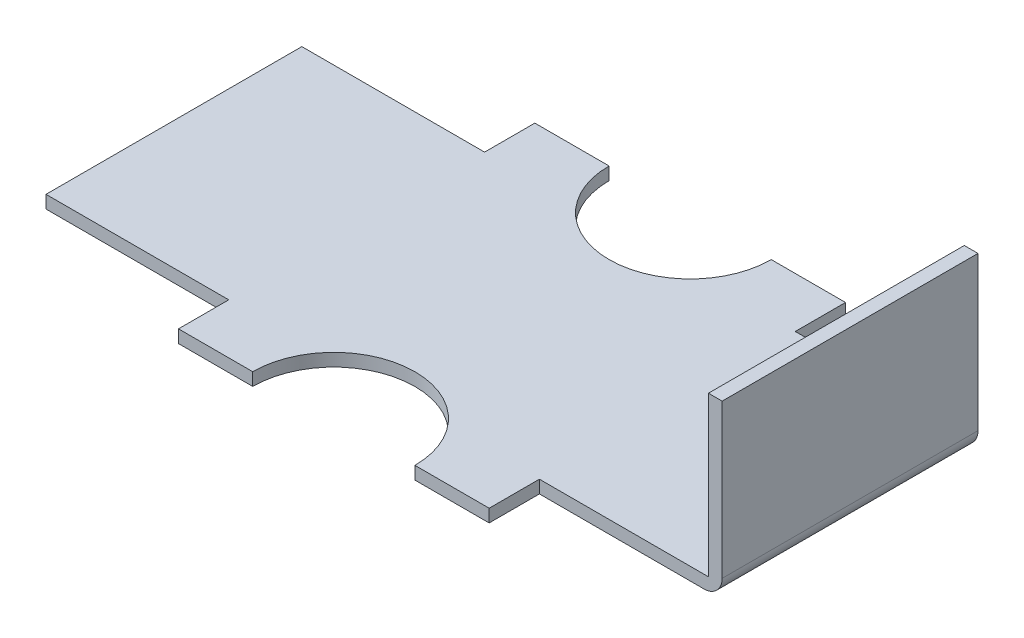
ISO-10303-21;
HEADER;
FILE_DESCRIPTION(('STEP AP214'),'2;1');
FILE_NAME('part.step','',(''),(''),'','','');
FILE_SCHEMA(('AUTOMOTIVE_DESIGN { 1 0 10303 214 1 1 1 1 }'));
ENDSEC;
DATA;
#1=APPLICATION_CONTEXT('core data for automotive mechanical design processes');
#2=APPLICATION_PROTOCOL_DEFINITION('international standard','automotive_design',2000,#1);
#3=PRODUCT_CONTEXT('',#1,'mechanical');
#4=PRODUCT('Part','Part','',(#3));
#5=PRODUCT_RELATED_PRODUCT_CATEGORY('part','',(#4));
#6=PRODUCT_DEFINITION_FORMATION('','',#4);
#7=PRODUCT_DEFINITION_CONTEXT('part definition',#1,'design');
#8=PRODUCT_DEFINITION('design','',#6,#7);
#9=PRODUCT_DEFINITION_SHAPE('','',#8);
#10=(LENGTH_UNIT() NAMED_UNIT(*) SI_UNIT(.MILLI.,.METRE.));
#11=(NAMED_UNIT(*) PLANE_ANGLE_UNIT() SI_UNIT($,.RADIAN.));
#12=(NAMED_UNIT(*) SI_UNIT($,.STERADIAN.) SOLID_ANGLE_UNIT());
#13=UNCERTAINTY_MEASURE_WITH_UNIT(LENGTH_MEASURE(1.E-05),#10,'distance_accuracy_value','');
#14=(GEOMETRIC_REPRESENTATION_CONTEXT(3) GLOBAL_UNCERTAINTY_ASSIGNED_CONTEXT((#13)) GLOBAL_UNIT_ASSIGNED_CONTEXT((#10,
#11,#12)) REPRESENTATION_CONTEXT('',''));
#15=CARTESIAN_POINT('',(0.,0.,0.));
#16=DIRECTION('',(0.,0.,1.));
#17=DIRECTION('',(1.,0.,0.));
#18=AXIS2_PLACEMENT_3D('',#15,#16,#17);
#19=CARTESIAN_POINT('',(0.,0.3556,0.));
#20=DIRECTION('',(0.,-1.,0.));
#21=DIRECTION('',(0.,0.,-1.));
#22=AXIS2_PLACEMENT_3D('',#19,#20,#21);
#23=PLANE('',#22);
#24=DIRECTION('',(0.,0.,1.));
#25=VECTOR('',#24,1.);
#26=CARTESIAN_POINT('',(9.017,0.3556,-3.556));
#27=LINE('',#26,#25);
#28=CARTESIAN_POINT('',(9.017,0.3556,-3.556));
#29=VERTEX_POINT('',#28);
#30=CARTESIAN_POINT('',(9.017,0.3556,3.556));
#31=VERTEX_POINT('',#30);
#32=EDGE_CURVE('E197',#29,#31,#27,.T.);
#33=ORIENTED_EDGE('',*,*,#32,.F.);
#34=DIRECTION('',(1.,0.,0.));
#35=VECTOR('',#34,1.);
#36=CARTESIAN_POINT('',(9.398,0.3556,-3.556));
#37=LINE('',#36,#35);
#38=CARTESIAN_POINT('',(4.318,0.3556,-3.556));
#39=VERTEX_POINT('',#38);
#40=EDGE_CURVE('E269',#39,#29,#37,.T.);
#41=ORIENTED_EDGE('',*,*,#40,.F.);
#42=DIRECTION('',(0.,0.,1.));
#43=VECTOR('',#42,1.);
#44=CARTESIAN_POINT('',(4.318,0.3556,-4.953));
#45=LINE('',#44,#43);
#46=CARTESIAN_POINT('',(4.318,0.3556,-4.953));
#47=VERTEX_POINT('',#46);
#48=EDGE_CURVE('E273',#47,#39,#45,.T.);
#49=ORIENTED_EDGE('',*,*,#48,.F.);
#50=DIRECTION('',(-1.,0.,0.));
#51=VECTOR('',#50,1.);
#52=CARTESIAN_POINT('',(-9.398,0.3556,-4.953));
#53=LINE('',#52,#51);
#54=CARTESIAN_POINT('',(2.25425,0.3556,-4.953));
#55=VERTEX_POINT('',#54);
#56=EDGE_CURVE('E332',#47,#55,#53,.T.);
#57=ORIENTED_EDGE('',*,*,#56,.T.);
#58=CARTESIAN_POINT('',(0.,0.3556,-4.953));
#59=DIRECTION('',(0.,1.,0.));
#60=DIRECTION('',(0.,0.,1.));
#61=AXIS2_PLACEMENT_3D('',#58,#59,#60);
#62=CIRCLE('',#61,2.25425);
#63=CARTESIAN_POINT('',(-2.25425,0.3556,-4.953));
#64=VERTEX_POINT('',#63);
#65=EDGE_CURVE('E258',#64,#55,#62,.T.);
#66=ORIENTED_EDGE('',*,*,#65,.F.);
#67=CARTESIAN_POINT('',(-4.318,0.3556,-4.953));
#68=VERTEX_POINT('',#67);
#69=EDGE_CURVE('E328',#64,#68,#53,.T.);
#70=ORIENTED_EDGE('',*,*,#69,.T.);
#71=DIRECTION('',(0.,0.,-1.));
#72=VECTOR('',#71,1.);
#73=CARTESIAN_POINT('',(-4.318,0.3556,-4.953));
#74=LINE('',#73,#72);
#75=CARTESIAN_POINT('',(-4.318,0.3556,-3.556));
#76=VERTEX_POINT('',#75);
#77=EDGE_CURVE('E244',#76,#68,#74,.T.);
#78=ORIENTED_EDGE('',*,*,#77,.F.);
#79=DIRECTION('',(1.,0.,0.));
#80=VECTOR('',#79,1.);
#81=CARTESIAN_POINT('',(-9.398,0.3556,-3.556));
#82=LINE('',#81,#80);
#83=CARTESIAN_POINT('',(-9.398,0.3556,-3.556));
#84=VERTEX_POINT('',#83);
#85=EDGE_CURVE('E178',#84,#76,#82,.T.);
#86=ORIENTED_EDGE('',*,*,#85,.F.);
#87=DIRECTION('',(0.,0.,1.));
#88=VECTOR('',#87,1.);
#89=CARTESIAN_POINT('',(-9.398,0.3556,4.953));
#90=LINE('',#89,#88);
#91=CARTESIAN_POINT('',(-9.398,0.3556,3.556));
#92=VERTEX_POINT('',#91);
#93=EDGE_CURVE('E334',#84,#92,#90,.T.);
#94=ORIENTED_EDGE('',*,*,#93,.T.);
#95=DIRECTION('',(-1.,0.,0.));
#96=VECTOR('',#95,1.);
#97=CARTESIAN_POINT('',(-9.398,0.3556,3.556));
#98=LINE('',#97,#96);
#99=CARTESIAN_POINT('',(-4.318,0.3556,3.556));
#100=VERTEX_POINT('',#99);
#101=EDGE_CURVE('E219',#100,#92,#98,.T.);
#102=ORIENTED_EDGE('',*,*,#101,.F.);
#103=DIRECTION('',(0.,0.,-1.));
#104=VECTOR('',#103,1.);
#105=CARTESIAN_POINT('',(-4.318,0.3556,4.953));
#106=LINE('',#105,#104);
#107=CARTESIAN_POINT('',(-4.318,0.3556,4.953));
#108=VERTEX_POINT('',#107);
#109=EDGE_CURVE('E213',#108,#100,#106,.T.);
#110=ORIENTED_EDGE('',*,*,#109,.F.);
#111=DIRECTION('',(1.,0.,0.));
#112=VECTOR('',#111,1.);
#113=CARTESIAN_POINT('',(-9.398,0.3556,4.953));
#114=LINE('',#113,#112);
#115=CARTESIAN_POINT('',(-2.25425,0.3556,4.953));
#116=VERTEX_POINT('',#115);
#117=EDGE_CURVE('E342',#108,#116,#114,.T.);
#118=ORIENTED_EDGE('',*,*,#117,.T.);
#119=CARTESIAN_POINT('',(0.,0.3556,4.953));
#120=DIRECTION('',(0.,1.,0.));
#121=DIRECTION('',(0.,0.,-1.));
#122=AXIS2_PLACEMENT_3D('',#119,#120,#121);
#123=CIRCLE('',#122,2.25425);
#124=CARTESIAN_POINT('',(2.25425,0.3556,4.953));
#125=VERTEX_POINT('',#124);
#126=EDGE_CURVE('E233',#125,#116,#123,.T.);
#127=ORIENTED_EDGE('',*,*,#126,.F.);
#128=CARTESIAN_POINT('',(4.318,0.3556,4.953));
#129=VERTEX_POINT('',#128);
#130=EDGE_CURVE('E338',#125,#129,#114,.T.);
#131=ORIENTED_EDGE('',*,*,#130,.T.);
#132=DIRECTION('',(0.,0.,1.));
#133=VECTOR('',#132,1.);
#134=CARTESIAN_POINT('',(4.318,0.3556,4.953));
#135=LINE('',#134,#133);
#136=CARTESIAN_POINT('',(4.318,0.3556,3.556));
#137=VERTEX_POINT('',#136);
#138=EDGE_CURVE('E288',#137,#129,#135,.T.);
#139=ORIENTED_EDGE('',*,*,#138,.F.);
#140=DIRECTION('',(-1.,0.,0.));
#141=VECTOR('',#140,1.);
#142=CARTESIAN_POINT('',(9.398,0.3556,3.556));
#143=LINE('',#142,#141);
#144=EDGE_CURVE('E293',#31,#137,#143,.T.);
#145=ORIENTED_EDGE('',*,*,#144,.F.);
#146=EDGE_LOOP('',(#33,#41,#49,#57,#66,#70,#78,#86,#94,#102,#110,#118,#127,#131,#139,#145));
#147=FACE_BOUND('',#146,.T.);
#148=ADVANCED_FACE('F39',(#147),#23,.F.);
#149=CARTESIAN_POINT('',(-9.398,0.3556,-4.953));
#150=DIRECTION('',(0.,0.,1.));
#151=DIRECTION('',(1.,0.,0.));
#152=AXIS2_PLACEMENT_3D('',#149,#150,#151);
#153=PLANE('',#152);
#154=ORIENTED_EDGE('',*,*,#56,.F.);
#155=DIRECTION('',(0.,1.,0.));
#156=VECTOR('',#155,1.);
#157=CARTESIAN_POINT('',(4.318,0.,-4.953));
#158=LINE('',#157,#156);
#159=CARTESIAN_POINT('',(4.318,0.,-4.953));
#160=VERTEX_POINT('',#159);
#161=EDGE_CURVE('E272',#160,#47,#158,.T.);
#162=ORIENTED_EDGE('',*,*,#161,.F.);
#163=DIRECTION('',(-1.,0.,0.));
#164=VECTOR('',#163,1.);
#165=CARTESIAN_POINT('',(-9.398,0.,-4.953));
#166=LINE('',#165,#164);
#167=CARTESIAN_POINT('',(2.25425,0.,-4.953));
#168=VERTEX_POINT('',#167);
#169=EDGE_CURVE('E346',#160,#168,#166,.T.);
#170=ORIENTED_EDGE('',*,*,#169,.T.);
#171=DIRECTION('',(0.,1.,0.));
#172=VECTOR('',#171,1.);
#173=CARTESIAN_POINT('',(2.25425,0.,-4.953));
#174=LINE('',#173,#172);
#175=EDGE_CURVE('E315',#168,#55,#174,.T.);
#176=ORIENTED_EDGE('',*,*,#175,.T.);
#177=EDGE_LOOP('',(#154,#162,#170,#176));
#178=FACE_BOUND('',#177,.T.);
#179=ADVANCED_FACE('F377',(#178),#153,.F.);
#180=CARTESIAN_POINT('',(-9.398,0.3556,4.953));
#181=DIRECTION('',(0.,0.,-1.));
#182=DIRECTION('',(-1.,0.,0.));
#183=AXIS2_PLACEMENT_3D('',#180,#181,#182);
#184=PLANE('',#183);
#185=DIRECTION('',(1.,0.,0.));
#186=VECTOR('',#185,1.);
#187=CARTESIAN_POINT('',(-9.398,0.,4.953));
#188=LINE('',#187,#186);
#189=CARTESIAN_POINT('',(-4.318,0.,4.953));
#190=VERTEX_POINT('',#189);
#191=CARTESIAN_POINT('',(-2.25425,0.,4.953));
#192=VERTEX_POINT('',#191);
#193=EDGE_CURVE('E333',#190,#192,#188,.T.);
#194=ORIENTED_EDGE('',*,*,#193,.T.);
#195=DIRECTION('',(0.,1.,0.));
#196=VECTOR('',#195,1.);
#197=CARTESIAN_POINT('',(-2.25425,0.,4.953));
#198=LINE('',#197,#196);
#199=EDGE_CURVE('E323',#192,#116,#198,.T.);
#200=ORIENTED_EDGE('',*,*,#199,.T.);
#201=ORIENTED_EDGE('',*,*,#117,.F.);
#202=DIRECTION('',(0.,1.,0.));
#203=VECTOR('',#202,1.);
#204=CARTESIAN_POINT('',(-4.318,0.,4.953));
#205=LINE('',#204,#203);
#206=EDGE_CURVE('E223',#190,#108,#205,.T.);
#207=ORIENTED_EDGE('',*,*,#206,.F.);
#208=EDGE_LOOP('',(#194,#200,#201,#207));
#209=FACE_BOUND('',#208,.T.);
#210=ADVANCED_FACE('F415',(#209),#184,.F.);
#211=CARTESIAN_POINT('',(9.398,0.3556,4.953));
#212=DIRECTION('',(-1.,0.,0.));
#213=DIRECTION('',(0.,0.,1.));
#214=AXIS2_PLACEMENT_3D('',#211,#212,#213);
#215=PLANE('',#214);
#216=DIRECTION('',(0.,1.,0.));
#217=VECTOR('',#216,1.);
#218=CARTESIAN_POINT('',(9.398,0.,3.556));
#219=LINE('',#218,#217);
#220=CARTESIAN_POINT('',(9.398,0.508,3.556));
#221=VERTEX_POINT('',#220);
#222=CARTESIAN_POINT('',(9.398,4.7752,3.556));
#223=VERTEX_POINT('',#222);
#224=EDGE_CURVE('E292',#221,#223,#219,.T.);
#225=ORIENTED_EDGE('',*,*,#224,.F.);
#226=DIRECTION('',(0.,0.,-1.));
#227=VECTOR('',#226,1.);
#228=CARTESIAN_POINT('',(9.398,0.508,-3.556));
#229=LINE('',#228,#227);
#230=CARTESIAN_POINT('',(9.398,0.508,-3.556));
#231=VERTEX_POINT('',#230);
#232=EDGE_CURVE('E176',#221,#231,#229,.T.);
#233=ORIENTED_EDGE('',*,*,#232,.T.);
#234=DIRECTION('',(0.,1.,0.));
#235=VECTOR('',#234,1.);
#236=CARTESIAN_POINT('',(9.398,0.,-3.556));
#237=LINE('',#236,#235);
#238=CARTESIAN_POINT('',(9.398,4.7752,-3.556));
#239=VERTEX_POINT('',#238);
#240=EDGE_CURVE('E169',#231,#239,#237,.T.);
#241=ORIENTED_EDGE('',*,*,#240,.T.);
#242=DIRECTION('',(0.,0.,-1.));
#243=VECTOR('',#242,1.);
#244=CARTESIAN_POINT('',(9.398,4.7752,-3.556));
#245=LINE('',#244,#243);
#246=EDGE_CURVE('E174',#223,#239,#245,.T.);
#247=ORIENTED_EDGE('',*,*,#246,.F.);
#248=EDGE_LOOP('',(#225,#233,#241,#247));
#249=FACE_BOUND('',#248,.T.);
#250=ADVANCED_FACE('F172',(#249),#215,.F.);
#251=CARTESIAN_POINT('',(-2.25425,0.,-4.953));
#252=VERTEX_POINT('',#251);
#253=CARTESIAN_POINT('',(-4.318,0.,-4.953));
#254=VERTEX_POINT('',#253);
#255=EDGE_CURVE('E327',#252,#254,#166,.T.);
#256=ORIENTED_EDGE('',*,*,#255,.T.);
#257=DIRECTION('',(0.,1.,0.));
#258=VECTOR('',#257,1.);
#259=CARTESIAN_POINT('',(-4.318,0.,-4.953));
#260=LINE('',#259,#258);
#261=EDGE_CURVE('E254',#254,#68,#260,.T.);
#262=ORIENTED_EDGE('',*,*,#261,.T.);
#263=ORIENTED_EDGE('',*,*,#69,.F.);
#264=DIRECTION('',(0.,1.,0.));
#265=VECTOR('',#264,1.);
#266=CARTESIAN_POINT('',(-2.25425,0.,-4.953));
#267=LINE('',#266,#265);
#268=EDGE_CURVE('E311',#64,#252,#267,.F.);
#269=ORIENTED_EDGE('',*,*,#268,.T.);
#270=EDGE_LOOP('',(#256,#262,#263,#269));
#271=FACE_BOUND('',#270,.T.);
#272=ADVANCED_FACE('F386',(#271),#153,.F.);
#273=CARTESIAN_POINT('',(-9.398,0.3556,4.953));
#274=DIRECTION('',(1.,0.,0.));
#275=DIRECTION('',(0.,0.,-1.));
#276=AXIS2_PLACEMENT_3D('',#273,#274,#275);
#277=PLANE('',#276);
#278=ORIENTED_EDGE('',*,*,#93,.F.);
#279=DIRECTION('',(0.,1.,0.));
#280=VECTOR('',#279,1.);
#281=CARTESIAN_POINT('',(-9.398,0.,-3.556));
#282=LINE('',#281,#280);
#283=CARTESIAN_POINT('',(-9.398,0.,-3.556));
#284=VERTEX_POINT('',#283);
#285=EDGE_CURVE('E248',#284,#84,#282,.T.);
#286=ORIENTED_EDGE('',*,*,#285,.F.);
#287=DIRECTION('',(0.,0.,1.));
#288=VECTOR('',#287,1.);
#289=CARTESIAN_POINT('',(-9.398,0.,4.953));
#290=LINE('',#289,#288);
#291=CARTESIAN_POINT('',(-9.398,0.,3.556));
#292=VERTEX_POINT('',#291);
#293=EDGE_CURVE('E347',#284,#292,#290,.T.);
#294=ORIENTED_EDGE('',*,*,#293,.T.);
#295=DIRECTION('',(0.,1.,0.));
#296=VECTOR('',#295,1.);
#297=CARTESIAN_POINT('',(-9.398,0.,3.556));
#298=LINE('',#297,#296);
#299=EDGE_CURVE('E229',#292,#92,#298,.T.);
#300=ORIENTED_EDGE('',*,*,#299,.T.);
#301=EDGE_LOOP('',(#278,#286,#294,#300));
#302=FACE_BOUND('',#301,.T.);
#303=ADVANCED_FACE('F427',(#302),#277,.F.);
#304=CARTESIAN_POINT('',(2.25425,0.,4.953));
#305=VERTEX_POINT('',#304);
#306=CARTESIAN_POINT('',(4.318,0.,4.953));
#307=VERTEX_POINT('',#306);
#308=EDGE_CURVE('E351',#305,#307,#188,.T.);
#309=ORIENTED_EDGE('',*,*,#308,.T.);
#310=DIRECTION('',(0.,1.,0.));
#311=VECTOR('',#310,1.);
#312=CARTESIAN_POINT('',(4.318,0.,4.953));
#313=LINE('',#312,#311);
#314=EDGE_CURVE('E277',#307,#129,#313,.T.);
#315=ORIENTED_EDGE('',*,*,#314,.T.);
#316=ORIENTED_EDGE('',*,*,#130,.F.);
#317=DIRECTION('',(0.,1.,0.));
#318=VECTOR('',#317,1.);
#319=CARTESIAN_POINT('',(2.25425,0.,4.953));
#320=LINE('',#319,#318);
#321=EDGE_CURVE('E319',#125,#305,#320,.F.);
#322=ORIENTED_EDGE('',*,*,#321,.T.);
#323=EDGE_LOOP('',(#309,#315,#316,#322));
#324=FACE_BOUND('',#323,.T.);
#325=ADVANCED_FACE('F407',(#324),#184,.F.);
#326=CARTESIAN_POINT('',(0.,0.,0.));
#327=DIRECTION('',(0.,-1.,0.));
#328=DIRECTION('',(0.,0.,-1.));
#329=AXIS2_PLACEMENT_3D('',#326,#327,#328);
#330=PLANE('',#329);
#331=DIRECTION('',(1.,0.,0.));
#332=VECTOR('',#331,1.);
#333=CARTESIAN_POINT('',(9.398,0.,-3.556));
#334=LINE('',#333,#332);
#335=CARTESIAN_POINT('',(4.318,0.,-3.556));
#336=VERTEX_POINT('',#335);
#337=CARTESIAN_POINT('',(8.89,0.,-3.556));
#338=VERTEX_POINT('',#337);
#339=EDGE_CURVE('E268',#336,#338,#334,.T.);
#340=ORIENTED_EDGE('',*,*,#339,.T.);
#341=DIRECTION('',(0.,0.,-1.));
#342=VECTOR('',#341,1.);
#343=CARTESIAN_POINT('',(8.89,0.,3.556));
#344=LINE('',#343,#342);
#345=CARTESIAN_POINT('',(8.89,0.,3.556));
#346=VERTEX_POINT('',#345);
#347=EDGE_CURVE('E48',#338,#346,#344,.F.);
#348=ORIENTED_EDGE('',*,*,#347,.T.);
#349=DIRECTION('',(-1.,0.,0.));
#350=VECTOR('',#349,1.);
#351=CARTESIAN_POINT('',(9.398,0.,3.556));
#352=LINE('',#351,#350);
#353=CARTESIAN_POINT('',(4.318,0.,3.556));
#354=VERTEX_POINT('',#353);
#355=EDGE_CURVE('E284',#346,#354,#352,.T.);
#356=ORIENTED_EDGE('',*,*,#355,.T.);
#357=DIRECTION('',(0.,0.,1.));
#358=VECTOR('',#357,1.);
#359=CARTESIAN_POINT('',(4.318,0.,4.953));
#360=LINE('',#359,#358);
#361=EDGE_CURVE('E287',#354,#307,#360,.T.);
#362=ORIENTED_EDGE('',*,*,#361,.T.);
#363=ORIENTED_EDGE('',*,*,#308,.F.);
#364=CARTESIAN_POINT('',(0.,0.,4.953));
#365=DIRECTION('',(0.,-1.,0.));
#366=DIRECTION('',(0.,0.,-1.));
#367=AXIS2_PLACEMENT_3D('',#364,#365,#366);
#368=CIRCLE('',#367,2.25425);
#369=EDGE_CURVE('E358',#192,#305,#368,.T.);
#370=ORIENTED_EDGE('',*,*,#369,.F.);
#371=ORIENTED_EDGE('',*,*,#193,.F.);
#372=DIRECTION('',(0.,0.,-1.));
#373=VECTOR('',#372,1.);
#374=CARTESIAN_POINT('',(-4.318,0.,4.953));
#375=LINE('',#374,#373);
#376=CARTESIAN_POINT('',(-4.318,0.,3.556));
#377=VERTEX_POINT('',#376);
#378=EDGE_CURVE('E214',#190,#377,#375,.T.);
#379=ORIENTED_EDGE('',*,*,#378,.T.);
#380=DIRECTION('',(-1.,0.,0.));
#381=VECTOR('',#380,1.);
#382=CARTESIAN_POINT('',(-9.398,0.,3.556));
#383=LINE('',#382,#381);
#384=EDGE_CURVE('E218',#377,#292,#383,.T.);
#385=ORIENTED_EDGE('',*,*,#384,.T.);
#386=ORIENTED_EDGE('',*,*,#293,.F.);
#387=DIRECTION('',(1.,0.,0.));
#388=VECTOR('',#387,1.);
#389=CARTESIAN_POINT('',(-9.398,0.,-3.556));
#390=LINE('',#389,#388);
#391=CARTESIAN_POINT('',(-4.318,0.,-3.556));
#392=VERTEX_POINT('',#391);
#393=EDGE_CURVE('E239',#284,#392,#390,.T.);
#394=ORIENTED_EDGE('',*,*,#393,.T.);
#395=DIRECTION('',(0.,0.,-1.));
#396=VECTOR('',#395,1.);
#397=CARTESIAN_POINT('',(-4.318,0.,-4.953));
#398=LINE('',#397,#396);
#399=EDGE_CURVE('E243',#392,#254,#398,.T.);
#400=ORIENTED_EDGE('',*,*,#399,.T.);
#401=ORIENTED_EDGE('',*,*,#255,.F.);
#402=CARTESIAN_POINT('',(0.,0.,-4.953));
#403=DIRECTION('',(0.,-1.,0.));
#404=DIRECTION('',(0.,0.,-1.));
#405=AXIS2_PLACEMENT_3D('',#402,#403,#404);
#406=CIRCLE('',#405,2.25425);
#407=EDGE_CURVE('E355',#168,#252,#406,.T.);
#408=ORIENTED_EDGE('',*,*,#407,.F.);
#409=ORIENTED_EDGE('',*,*,#169,.F.);
#410=DIRECTION('',(0.,0.,1.));
#411=VECTOR('',#410,1.);
#412=CARTESIAN_POINT('',(4.318,0.,-4.953));
#413=LINE('',#412,#411);
#414=EDGE_CURVE('E264',#160,#336,#413,.T.);
#415=ORIENTED_EDGE('',*,*,#414,.T.);
#416=EDGE_LOOP('',(#340,#348,#356,#362,#363,#370,#371,#379,#385,#386,#394,#400,#401,#408,#409,#415));
#417=FACE_BOUND('',#416,.T.);
#418=ADVANCED_FACE('F379',(#417),#330,.T.);
#419=CARTESIAN_POINT('',(0.,0.,-4.953));
#420=DIRECTION('',(0.,1.,0.));
#421=DIRECTION('',(0.,0.,1.));
#422=AXIS2_PLACEMENT_3D('',#419,#420,#421);
#423=CYLINDRICAL_SURFACE('',#422,2.25425);
#424=ORIENTED_EDGE('',*,*,#407,.T.);
#425=ORIENTED_EDGE('',*,*,#268,.F.);
#426=ORIENTED_EDGE('',*,*,#65,.T.);
#427=ORIENTED_EDGE('',*,*,#175,.F.);
#428=EDGE_LOOP('',(#424,#425,#426,#427));
#429=FACE_BOUND('',#428,.T.);
#430=ADVANCED_FACE('F382',(#429),#423,.F.);
#431=CARTESIAN_POINT('',(-9.398,0.,3.556));
#432=DIRECTION('',(0.,0.,-1.));
#433=DIRECTION('',(-1.,0.,0.));
#434=AXIS2_PLACEMENT_3D('',#431,#432,#433);
#435=PLANE('',#434);
#436=ORIENTED_EDGE('',*,*,#101,.T.);
#437=ORIENTED_EDGE('',*,*,#299,.F.);
#438=ORIENTED_EDGE('',*,*,#384,.F.);
#439=DIRECTION('',(0.,1.,0.));
#440=VECTOR('',#439,1.);
#441=CARTESIAN_POINT('',(-4.318,0.,3.556));
#442=LINE('',#441,#440);
#443=EDGE_CURVE('E234',#377,#100,#442,.T.);
#444=ORIENTED_EDGE('',*,*,#443,.T.);
#445=EDGE_LOOP('',(#436,#437,#438,#444));
#446=FACE_BOUND('',#445,.T.);
#447=ADVANCED_FACE('F424',(#446),#435,.F.);
#448=CARTESIAN_POINT('',(-4.318,0.,4.953));
#449=DIRECTION('',(1.,0.,0.));
#450=DIRECTION('',(0.,0.,-1.));
#451=AXIS2_PLACEMENT_3D('',#448,#449,#450);
#452=PLANE('',#451);
#453=ORIENTED_EDGE('',*,*,#109,.T.);
#454=ORIENTED_EDGE('',*,*,#443,.F.);
#455=ORIENTED_EDGE('',*,*,#378,.F.);
#456=ORIENTED_EDGE('',*,*,#206,.T.);
#457=EDGE_LOOP('',(#453,#454,#455,#456));
#458=FACE_BOUND('',#457,.T.);
#459=ADVANCED_FACE('F421',(#458),#452,.F.);
#460=CARTESIAN_POINT('',(0.,0.,4.953));
#461=DIRECTION('',(0.,1.,0.));
#462=DIRECTION('',(0.,0.,1.));
#463=AXIS2_PLACEMENT_3D('',#460,#461,#462);
#464=CYLINDRICAL_SURFACE('',#463,2.25425);
#465=ORIENTED_EDGE('',*,*,#369,.T.);
#466=ORIENTED_EDGE('',*,*,#321,.F.);
#467=ORIENTED_EDGE('',*,*,#126,.T.);
#468=ORIENTED_EDGE('',*,*,#199,.F.);
#469=EDGE_LOOP('',(#465,#466,#467,#468));
#470=FACE_BOUND('',#469,.T.);
#471=ADVANCED_FACE('F412',(#470),#464,.F.);
#472=CARTESIAN_POINT('',(4.318,0.,4.953));
#473=DIRECTION('',(-1.,0.,0.));
#474=DIRECTION('',(0.,0.,1.));
#475=AXIS2_PLACEMENT_3D('',#472,#473,#474);
#476=PLANE('',#475);
#477=ORIENTED_EDGE('',*,*,#138,.T.);
#478=ORIENTED_EDGE('',*,*,#314,.F.);
#479=ORIENTED_EDGE('',*,*,#361,.F.);
#480=DIRECTION('',(0.,1.,0.));
#481=VECTOR('',#480,1.);
#482=CARTESIAN_POINT('',(4.318,0.,3.556));
#483=LINE('',#482,#481);
#484=EDGE_CURVE('E301',#354,#137,#483,.T.);
#485=ORIENTED_EDGE('',*,*,#484,.T.);
#486=EDGE_LOOP('',(#477,#478,#479,#485));
#487=FACE_BOUND('',#486,.T.);
#488=ADVANCED_FACE('F403',(#487),#476,.F.);
#489=CARTESIAN_POINT('',(9.398,0.,3.556));
#490=DIRECTION('',(0.,0.,-1.));
#491=DIRECTION('',(-1.,0.,0.));
#492=AXIS2_PLACEMENT_3D('',#489,#490,#491);
#493=PLANE('',#492);
#494=ORIENTED_EDGE('',*,*,#355,.F.);
#495=CARTESIAN_POINT('',(8.89,0.508,3.556));
#496=DIRECTION('',(0.,0.,-1.));
#497=DIRECTION('',(-1.,0.,0.));
#498=AXIS2_PLACEMENT_3D('',#495,#496,#497);
#499=CIRCLE('',#498,0.508);
#500=EDGE_CURVE('E11',#346,#221,#499,.F.);
#501=ORIENTED_EDGE('',*,*,#500,.T.);
#502=ORIENTED_EDGE('',*,*,#224,.T.);
#503=DIRECTION('',(1.,0.,0.));
#504=VECTOR('',#503,1.);
#505=CARTESIAN_POINT('',(9.398,4.7752,3.556));
#506=LINE('',#505,#504);
#507=CARTESIAN_POINT('',(9.017,4.7752,3.556));
#508=VERTEX_POINT('',#507);
#509=EDGE_CURVE('E195',#508,#223,#506,.T.);
#510=ORIENTED_EDGE('',*,*,#509,.F.);
#511=DIRECTION('',(0.,-1.,0.));
#512=VECTOR('',#511,1.);
#513=CARTESIAN_POINT('',(9.017,4.7752,3.556));
#514=LINE('',#513,#512);
#515=EDGE_CURVE('E206',#508,#31,#514,.T.);
#516=ORIENTED_EDGE('',*,*,#515,.T.);
#517=ORIENTED_EDGE('',*,*,#144,.T.);
#518=ORIENTED_EDGE('',*,*,#484,.F.);
#519=EDGE_LOOP('',(#494,#501,#502,#510,#516,#517,#518));
#520=FACE_BOUND('',#519,.T.);
#521=ADVANCED_FACE('F398',(#520),#493,.F.);
#522=CARTESIAN_POINT('',(9.398,0.,-3.556));
#523=DIRECTION('',(0.,0.,1.));
#524=DIRECTION('',(1.,0.,0.));
#525=AXIS2_PLACEMENT_3D('',#522,#523,#524);
#526=PLANE('',#525);
#527=ORIENTED_EDGE('',*,*,#240,.F.);
#528=CARTESIAN_POINT('',(8.89,0.508,-3.556));
#529=DIRECTION('',(0.,0.,1.));
#530=DIRECTION('',(1.,0.,0.));
#531=AXIS2_PLACEMENT_3D('',#528,#529,#530);
#532=CIRCLE('',#531,0.508);
#533=EDGE_CURVE('E62',#231,#338,#532,.F.);
#534=ORIENTED_EDGE('',*,*,#533,.T.);
#535=ORIENTED_EDGE('',*,*,#339,.F.);
#536=DIRECTION('',(0.,1.,0.));
#537=VECTOR('',#536,1.);
#538=CARTESIAN_POINT('',(4.318,0.,-3.556));
#539=LINE('',#538,#537);
#540=EDGE_CURVE('E179',#336,#39,#539,.T.);
#541=ORIENTED_EDGE('',*,*,#540,.T.);
#542=ORIENTED_EDGE('',*,*,#40,.T.);
#543=DIRECTION('',(0.,-1.,0.));
#544=VECTOR('',#543,1.);
#545=CARTESIAN_POINT('',(9.017,4.7752,-3.556));
#546=LINE('',#545,#544);
#547=CARTESIAN_POINT('',(9.017,4.7752,-3.556));
#548=VERTEX_POINT('',#547);
#549=EDGE_CURVE('E186',#548,#29,#546,.T.);
#550=ORIENTED_EDGE('',*,*,#549,.F.);
#551=DIRECTION('',(-1.,0.,0.));
#552=VECTOR('',#551,1.);
#553=CARTESIAN_POINT('',(9.398,4.7752,-3.556));
#554=LINE('',#553,#552);
#555=EDGE_CURVE('E182',#239,#548,#554,.T.);
#556=ORIENTED_EDGE('',*,*,#555,.F.);
#557=EDGE_LOOP('',(#527,#534,#535,#541,#542,#550,#556));
#558=FACE_BOUND('',#557,.T.);
#559=ADVANCED_FACE('F183',(#558),#526,.F.);
#560=CARTESIAN_POINT('',(4.318,0.,-4.953));
#561=DIRECTION('',(-1.,0.,0.));
#562=DIRECTION('',(0.,0.,1.));
#563=AXIS2_PLACEMENT_3D('',#560,#561,#562);
#564=PLANE('',#563);
#565=ORIENTED_EDGE('',*,*,#48,.T.);
#566=ORIENTED_EDGE('',*,*,#540,.F.);
#567=ORIENTED_EDGE('',*,*,#414,.F.);
#568=ORIENTED_EDGE('',*,*,#161,.T.);
#569=EDGE_LOOP('',(#565,#566,#567,#568));
#570=FACE_BOUND('',#569,.T.);
#571=ADVANCED_FACE('F394',(#570),#564,.F.);
#572=CARTESIAN_POINT('',(-4.318,0.,-4.953));
#573=DIRECTION('',(1.,0.,0.));
#574=DIRECTION('',(0.,0.,-1.));
#575=AXIS2_PLACEMENT_3D('',#572,#573,#574);
#576=PLANE('',#575);
#577=ORIENTED_EDGE('',*,*,#77,.T.);
#578=ORIENTED_EDGE('',*,*,#261,.F.);
#579=ORIENTED_EDGE('',*,*,#399,.F.);
#580=DIRECTION('',(0.,1.,0.));
#581=VECTOR('',#580,1.);
#582=CARTESIAN_POINT('',(-4.318,0.,-3.556));
#583=LINE('',#582,#581);
#584=EDGE_CURVE('E259',#392,#76,#583,.T.);
#585=ORIENTED_EDGE('',*,*,#584,.T.);
#586=EDGE_LOOP('',(#577,#578,#579,#585));
#587=FACE_BOUND('',#586,.T.);
#588=ADVANCED_FACE('F433',(#587),#576,.F.);
#589=CARTESIAN_POINT('',(-9.398,0.,-3.556));
#590=DIRECTION('',(0.,0.,1.));
#591=DIRECTION('',(1.,0.,0.));
#592=AXIS2_PLACEMENT_3D('',#589,#590,#591);
#593=PLANE('',#592);
#594=ORIENTED_EDGE('',*,*,#85,.T.);
#595=ORIENTED_EDGE('',*,*,#584,.F.);
#596=ORIENTED_EDGE('',*,*,#393,.F.);
#597=ORIENTED_EDGE('',*,*,#285,.T.);
#598=EDGE_LOOP('',(#594,#595,#596,#597));
#599=FACE_BOUND('',#598,.T.);
#600=ADVANCED_FACE('F431',(#599),#593,.F.);
#601=CARTESIAN_POINT('',(9.017,4.7752,-3.556));
#602=DIRECTION('',(1.,0.,0.));
#603=DIRECTION('',(0.,0.,-1.));
#604=AXIS2_PLACEMENT_3D('',#601,#602,#603);
#605=PLANE('',#604);
#606=ORIENTED_EDGE('',*,*,#32,.T.);
#607=ORIENTED_EDGE('',*,*,#515,.F.);
#608=DIRECTION('',(0.,0.,1.));
#609=VECTOR('',#608,1.);
#610=CARTESIAN_POINT('',(9.017,4.7752,-3.556));
#611=LINE('',#610,#609);
#612=EDGE_CURVE('E190',#548,#508,#611,.T.);
#613=ORIENTED_EDGE('',*,*,#612,.F.);
#614=ORIENTED_EDGE('',*,*,#549,.T.);
#615=EDGE_LOOP('',(#606,#607,#613,#614));
#616=FACE_BOUND('',#615,.T.);
#617=ADVANCED_FACE('F440',(#616),#605,.F.);
#618=CARTESIAN_POINT('',(0.,4.7752,0.));
#619=DIRECTION('',(0.,-1.,0.));
#620=DIRECTION('',(0.,0.,-1.));
#621=AXIS2_PLACEMENT_3D('',#618,#619,#620);
#622=PLANE('',#621);
#623=ORIENTED_EDGE('',*,*,#246,.T.);
#624=ORIENTED_EDGE('',*,*,#555,.T.);
#625=ORIENTED_EDGE('',*,*,#612,.T.);
#626=ORIENTED_EDGE('',*,*,#509,.T.);
#627=EDGE_LOOP('',(#623,#624,#625,#626));
#628=FACE_BOUND('',#627,.T.);
#629=ADVANCED_FACE('F193',(#628),#622,.F.);
#630=CARTESIAN_POINT('',(8.89,0.508,4.953));
#631=DIRECTION('',(0.,0.,1.));
#632=DIRECTION('',(1.,0.,0.));
#633=AXIS2_PLACEMENT_3D('',#630,#631,#632);
#634=CYLINDRICAL_SURFACE('',#633,0.508);
#635=ORIENTED_EDGE('',*,*,#500,.F.);
#636=ORIENTED_EDGE('',*,*,#347,.F.);
#637=ORIENTED_EDGE('',*,*,#533,.F.);
#638=ORIENTED_EDGE('',*,*,#232,.F.);
#639=EDGE_LOOP('',(#635,#636,#637,#638));
#640=FACE_BOUND('',#639,.T.);
#641=ADVANCED_FACE('F41',(#640),#634,.T.);
#642=CLOSED_SHELL('',(#148,#179,#210,#250,#272,#303,#325,#418,#430,#447,#459,#471,#488,#521,
#559,#571,#588,#600,#617,#629,#641));
#643=MANIFOLD_SOLID_BREP('B2',#642);
#644=ADVANCED_BREP_SHAPE_REPRESENTATION('',(#18,#643),#14);
#645=SHAPE_DEFINITION_REPRESENTATION(#9,#644);
ENDSEC;
END-ISO-10303-21;
